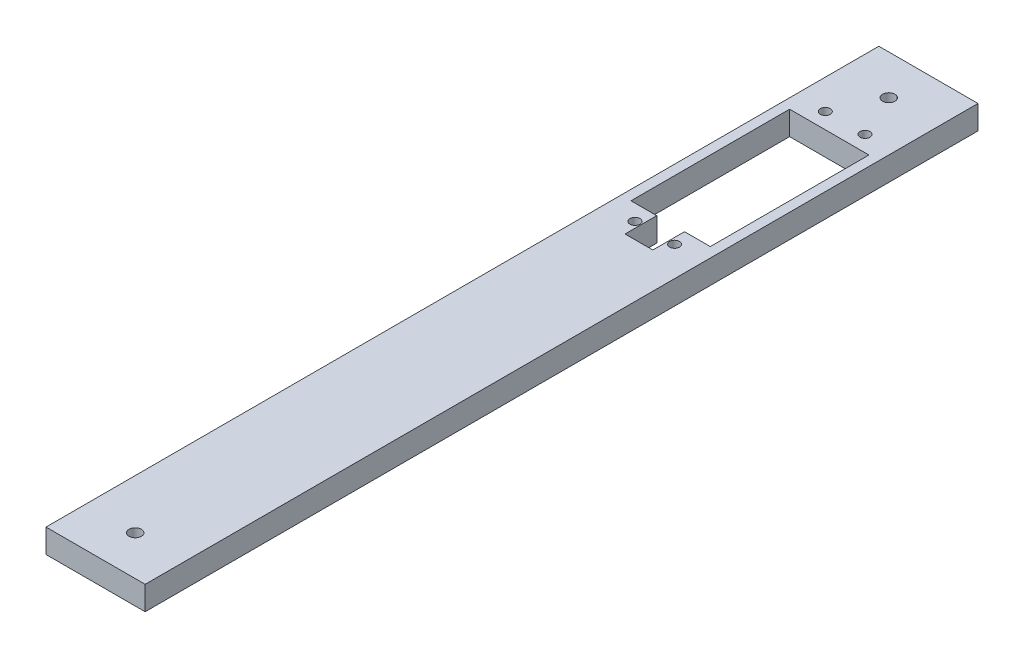
ISO-10303-21;
HEADER;
FILE_DESCRIPTION(('STEP AP214'),'2;1');
FILE_NAME('part.step','',(''),(''),'','','');
FILE_SCHEMA(('AUTOMOTIVE_DESIGN { 1 0 10303 214 1 1 1 1 }'));
ENDSEC;
DATA;
#1=APPLICATION_CONTEXT('core data for automotive mechanical design processes');
#2=APPLICATION_PROTOCOL_DEFINITION('international standard','automotive_design',2000,#1);
#3=PRODUCT_CONTEXT('',#1,'mechanical');
#4=PRODUCT('Part','Part','',(#3));
#5=PRODUCT_RELATED_PRODUCT_CATEGORY('part','',(#4));
#6=PRODUCT_DEFINITION_FORMATION('','',#4);
#7=PRODUCT_DEFINITION_CONTEXT('part definition',#1,'design');
#8=PRODUCT_DEFINITION('design','',#6,#7);
#9=PRODUCT_DEFINITION_SHAPE('','',#8);
#10=(LENGTH_UNIT() NAMED_UNIT(*) SI_UNIT(.MILLI.,.METRE.));
#11=(NAMED_UNIT(*) PLANE_ANGLE_UNIT() SI_UNIT($,.RADIAN.));
#12=(NAMED_UNIT(*) SI_UNIT($,.STERADIAN.) SOLID_ANGLE_UNIT());
#13=UNCERTAINTY_MEASURE_WITH_UNIT(LENGTH_MEASURE(1.E-05),#10,'distance_accuracy_value','');
#14=(GEOMETRIC_REPRESENTATION_CONTEXT(3) GLOBAL_UNCERTAINTY_ASSIGNED_CONTEXT((#13)) GLOBAL_UNIT_ASSIGNED_CONTEXT((#10,
#11,#12)) REPRESENTATION_CONTEXT('',''));
#15=CARTESIAN_POINT('',(0.,0.,0.));
#16=DIRECTION('',(0.,0.,1.));
#17=DIRECTION('',(1.,0.,0.));
#18=AXIS2_PLACEMENT_3D('',#15,#16,#17);
#19=CARTESIAN_POINT('',(-15.6277155080101,6.,-14.6035480061091));
#20=DIRECTION('',(0.,0.,-1.));
#21=DIRECTION('',(-1.,0.,0.));
#22=AXIS2_PLACEMENT_3D('',#19,#20,#21);
#23=PLANE('',#22);
#24=DIRECTION('',(1.,0.,0.));
#25=VECTOR('',#24,1.);
#26=CARTESIAN_POINT('',(-15.6277155080101,0.,-14.6035480061091));
#27=LINE('',#26,#25);
#28=CARTESIAN_POINT('',(-15.6277155080101,0.,-14.6035480061091));
#29=VERTEX_POINT('',#28);
#30=CARTESIAN_POINT('',(9.37228449198993,0.,-14.6035480061091));
#31=VERTEX_POINT('',#30);
#32=EDGE_CURVE('E198',#29,#31,#27,.T.);
#33=ORIENTED_EDGE('',*,*,#32,.F.);
#34=DIRECTION('',(0.,-1.,0.));
#35=VECTOR('',#34,1.);
#36=CARTESIAN_POINT('',(-15.6277155080101,6.,-14.6035480061091));
#37=LINE('',#36,#35);
#38=CARTESIAN_POINT('',(-15.6277155080101,6.,-14.6035480061091));
#39=VERTEX_POINT('',#38);
#40=EDGE_CURVE('E11',#39,#29,#37,.T.);
#41=ORIENTED_EDGE('',*,*,#40,.F.);
#42=DIRECTION('',(1.,0.,0.));
#43=VECTOR('',#42,1.);
#44=CARTESIAN_POINT('',(-15.6277155080101,6.,-14.6035480061091));
#45=LINE('',#44,#43);
#46=CARTESIAN_POINT('',(9.37228449198993,6.,-14.6035480061091));
#47=VERTEX_POINT('',#46);
#48=EDGE_CURVE('E207',#39,#47,#45,.T.);
#49=ORIENTED_EDGE('',*,*,#48,.T.);
#50=DIRECTION('',(0.,-1.,0.));
#51=VECTOR('',#50,1.);
#52=CARTESIAN_POINT('',(9.37228449198993,6.,-14.6035480061091));
#53=LINE('',#52,#51);
#54=EDGE_CURVE('E36',#47,#31,#53,.T.);
#55=ORIENTED_EDGE('',*,*,#54,.T.);
#56=EDGE_LOOP('',(#33,#41,#49,#55));
#57=FACE_BOUND('',#56,.T.);
#58=ADVANCED_FACE('F33',(#57),#23,.T.);
#59=CARTESIAN_POINT('',(-15.6277155080101,6.,-14.6035480061091));
#60=DIRECTION('',(1.,0.,0.));
#61=DIRECTION('',(0.,0.,-1.));
#62=AXIS2_PLACEMENT_3D('',#59,#60,#61);
#63=PLANE('',#62);
#64=DIRECTION('',(0.,0.,1.));
#65=VECTOR('',#64,1.);
#66=CARTESIAN_POINT('',(-15.6277155080101,0.,-14.6035480061091));
#67=LINE('',#66,#65);
#68=CARTESIAN_POINT('',(-15.62771550801,0.,195.396451993891));
#69=VERTEX_POINT('',#68);
#70=EDGE_CURVE('E211',#29,#69,#67,.T.);
#71=ORIENTED_EDGE('',*,*,#70,.T.);
#72=DIRECTION('',(0.,-1.,0.));
#73=VECTOR('',#72,1.);
#74=CARTESIAN_POINT('',(-15.62771550801,6.,195.396451993891));
#75=LINE('',#74,#73);
#76=CARTESIAN_POINT('',(-15.62771550801,6.,195.396451993891));
#77=VERTEX_POINT('',#76);
#78=EDGE_CURVE('E41',#77,#69,#75,.T.);
#79=ORIENTED_EDGE('',*,*,#78,.F.);
#80=DIRECTION('',(0.,0.,1.));
#81=VECTOR('',#80,1.);
#82=CARTESIAN_POINT('',(-15.6277155080101,6.,-14.6035480061091));
#83=LINE('',#82,#81);
#84=EDGE_CURVE('E216',#39,#77,#83,.T.);
#85=ORIENTED_EDGE('',*,*,#84,.F.);
#86=ORIENTED_EDGE('',*,*,#40,.T.);
#87=EDGE_LOOP('',(#71,#79,#85,#86));
#88=FACE_BOUND('',#87,.T.);
#89=ADVANCED_FACE('F242',(#88),#63,.F.);
#90=CARTESIAN_POINT('',(-15.62771550801,6.,195.396451993891));
#91=DIRECTION('',(0.,0.,-1.));
#92=DIRECTION('',(-1.,0.,0.));
#93=AXIS2_PLACEMENT_3D('',#90,#91,#92);
#94=PLANE('',#93);
#95=DIRECTION('',(1.,0.,0.));
#96=VECTOR('',#95,1.);
#97=CARTESIAN_POINT('',(-15.62771550801,0.,195.396451993891));
#98=LINE('',#97,#96);
#99=CARTESIAN_POINT('',(9.37228449198996,0.,195.396451993891));
#100=VERTEX_POINT('',#99);
#101=EDGE_CURVE('E223',#69,#100,#98,.T.);
#102=ORIENTED_EDGE('',*,*,#101,.T.);
#103=DIRECTION('',(0.,-1.,0.));
#104=VECTOR('',#103,1.);
#105=CARTESIAN_POINT('',(9.37228449198996,6.,195.396451993891));
#106=LINE('',#105,#104);
#107=CARTESIAN_POINT('',(9.37228449198996,6.,195.396451993891));
#108=VERTEX_POINT('',#107);
#109=EDGE_CURVE('E228',#108,#100,#106,.T.);
#110=ORIENTED_EDGE('',*,*,#109,.F.);
#111=DIRECTION('',(1.,0.,0.));
#112=VECTOR('',#111,1.);
#113=CARTESIAN_POINT('',(-15.62771550801,6.,195.396451993891));
#114=LINE('',#113,#112);
#115=EDGE_CURVE('E214',#77,#108,#114,.T.);
#116=ORIENTED_EDGE('',*,*,#115,.F.);
#117=ORIENTED_EDGE('',*,*,#78,.T.);
#118=EDGE_LOOP('',(#102,#110,#116,#117));
#119=FACE_BOUND('',#118,.T.);
#120=ADVANCED_FACE('F246',(#119),#94,.F.);
#121=CARTESIAN_POINT('',(9.37228449198993,6.,-14.6035480061091));
#122=DIRECTION('',(1.,0.,0.));
#123=DIRECTION('',(0.,0.,-1.));
#124=AXIS2_PLACEMENT_3D('',#121,#122,#123);
#125=PLANE('',#124);
#126=DIRECTION('',(0.,0.,1.));
#127=VECTOR('',#126,1.);
#128=CARTESIAN_POINT('',(9.37228449198993,0.,-14.6035480061091));
#129=LINE('',#128,#127);
#130=EDGE_CURVE('E220',#31,#100,#129,.T.);
#131=ORIENTED_EDGE('',*,*,#130,.F.);
#132=ORIENTED_EDGE('',*,*,#54,.F.);
#133=DIRECTION('',(0.,0.,1.));
#134=VECTOR('',#133,1.);
#135=CARTESIAN_POINT('',(9.37228449198993,6.,-14.6035480061091));
#136=LINE('',#135,#134);
#137=EDGE_CURVE('E210',#47,#108,#136,.T.);
#138=ORIENTED_EDGE('',*,*,#137,.T.);
#139=ORIENTED_EDGE('',*,*,#109,.T.);
#140=EDGE_LOOP('',(#131,#132,#138,#139));
#141=FACE_BOUND('',#140,.T.);
#142=ADVANCED_FACE('F236',(#141),#125,.T.);
#143=CARTESIAN_POINT('',(0.,6.,0.));
#144=DIRECTION('',(0.,-1.,0.));
#145=DIRECTION('',(0.,0.,-1.));
#146=AXIS2_PLACEMENT_3D('',#143,#144,#145);
#147=PLANE('',#146);
#148=CARTESIAN_POINT('',(-8.12771550801006,6.,6.39645199389089));
#149=DIRECTION('',(0.,1.,0.));
#150=DIRECTION('',(0.,0.,-1.));
#151=AXIS2_PLACEMENT_3D('',#148,#149,#150);
#152=CIRCLE('',#151,1.25);
#153=CARTESIAN_POINT('',(-8.12771550801006,6.,5.14645199389089));
#154=VERTEX_POINT('',#153);
#155=EDGE_CURVE('E147',#154,#154,#152,.T.);
#156=ORIENTED_EDGE('',*,*,#155,.F.);
#157=EDGE_LOOP('',(#156));
#158=FACE_BOUND('',#157,.T.);
#159=CARTESIAN_POINT('',(1.87228449198994,6.,6.39645199389089));
#160=DIRECTION('',(0.,1.,0.));
#161=DIRECTION('',(0.,0.,1.));
#162=AXIS2_PLACEMENT_3D('',#159,#160,#161);
#163=CIRCLE('',#162,1.25);
#164=CARTESIAN_POINT('',(1.87228449198994,6.,7.64645199389089));
#165=VERTEX_POINT('',#164);
#166=EDGE_CURVE('E429',#165,#165,#163,.T.);
#167=ORIENTED_EDGE('',*,*,#166,.F.);
#168=EDGE_LOOP('',(#167));
#169=FACE_BOUND('',#168,.T.);
#170=CARTESIAN_POINT('',(1.87228449198994,6.,54.3964519938909));
#171=DIRECTION('',(0.,1.,0.));
#172=DIRECTION('',(0.,0.,-1.));
#173=AXIS2_PLACEMENT_3D('',#170,#171,#172);
#174=CIRCLE('',#173,1.25);
#175=CARTESIAN_POINT('',(1.87228449198994,6.,53.1464519938909));
#176=VERTEX_POINT('',#175);
#177=EDGE_CURVE('E436',#176,#176,#174,.T.);
#178=ORIENTED_EDGE('',*,*,#177,.F.);
#179=EDGE_LOOP('',(#178));
#180=FACE_BOUND('',#179,.T.);
#181=CARTESIAN_POINT('',(-8.12771550801006,6.,54.3964519938909));
#182=DIRECTION('',(0.,1.,0.));
#183=DIRECTION('',(0.,0.,1.));
#184=AXIS2_PLACEMENT_3D('',#181,#182,#183);
#185=CIRCLE('',#184,1.25);
#186=CARTESIAN_POINT('',(-8.12771550801006,6.,55.6464519938909));
#187=VERTEX_POINT('',#186);
#188=EDGE_CURVE('E442',#187,#187,#185,.T.);
#189=ORIENTED_EDGE('',*,*,#188,.F.);
#190=EDGE_LOOP('',(#189));
#191=FACE_BOUND('',#190,.T.);
#192=DIRECTION('',(1.,0.,0.));
#193=VECTOR('',#192,1.);
#194=CARTESIAN_POINT('',(-13.1277155080101,6.,50.3964519938909));
#195=LINE('',#194,#193);
#196=CARTESIAN_POINT('',(-13.1277155080101,6.,50.3964519938909));
#197=VERTEX_POINT('',#196);
#198=CARTESIAN_POINT('',(-6.62771550801007,6.,50.3964519938909));
#199=VERTEX_POINT('',#198);
#200=EDGE_CURVE('E164',#197,#199,#195,.T.);
#201=ORIENTED_EDGE('',*,*,#200,.F.);
#202=DIRECTION('',(0.,0.,1.));
#203=VECTOR('',#202,1.);
#204=CARTESIAN_POINT('',(-13.1277155080101,6.,10.3964519938909));
#205=LINE('',#204,#203);
#206=CARTESIAN_POINT('',(-13.1277155080101,6.,10.3964519938909));
#207=VERTEX_POINT('',#206);
#208=EDGE_CURVE('E49',#207,#197,#205,.T.);
#209=ORIENTED_EDGE('',*,*,#208,.F.);
#210=DIRECTION('',(-1.,0.,0.));
#211=VECTOR('',#210,1.);
#212=CARTESIAN_POINT('',(-13.1277155080101,6.,10.3964519938909));
#213=LINE('',#212,#211);
#214=CARTESIAN_POINT('',(6.87228449198993,6.,10.3964519938909));
#215=VERTEX_POINT('',#214);
#216=EDGE_CURVE('E141',#215,#207,#213,.T.);
#217=ORIENTED_EDGE('',*,*,#216,.F.);
#218=DIRECTION('',(0.,0.,-1.));
#219=VECTOR('',#218,1.);
#220=CARTESIAN_POINT('',(6.87228449198993,6.,10.3964519938909));
#221=LINE('',#220,#219);
#222=CARTESIAN_POINT('',(6.87228449198994,6.,50.3964519938909));
#223=VERTEX_POINT('',#222);
#224=EDGE_CURVE('E144',#223,#215,#221,.T.);
#225=ORIENTED_EDGE('',*,*,#224,.F.);
#226=DIRECTION('',(1.,0.,0.));
#227=VECTOR('',#226,1.);
#228=CARTESIAN_POINT('',(0.372284491989933,6.,50.3964519938909));
#229=LINE('',#228,#227);
#230=CARTESIAN_POINT('',(0.372284491989933,6.,50.3964519938909));
#231=VERTEX_POINT('',#230);
#232=EDGE_CURVE('E176',#231,#223,#229,.T.);
#233=ORIENTED_EDGE('',*,*,#232,.F.);
#234=DIRECTION('',(0.,0.,-1.));
#235=VECTOR('',#234,1.);
#236=CARTESIAN_POINT('',(0.372284491989933,6.,58.3964519938909));
#237=LINE('',#236,#235);
#238=CARTESIAN_POINT('',(0.372284491989933,6.,58.3964519938909));
#239=VERTEX_POINT('',#238);
#240=EDGE_CURVE('E173',#239,#231,#237,.T.);
#241=ORIENTED_EDGE('',*,*,#240,.F.);
#242=DIRECTION('',(1.,0.,0.));
#243=VECTOR('',#242,1.);
#244=CARTESIAN_POINT('',(-6.62771550801007,6.,58.3964519938909));
#245=LINE('',#244,#243);
#246=CARTESIAN_POINT('',(-6.62771550801007,6.,58.3964519938909));
#247=VERTEX_POINT('',#246);
#248=EDGE_CURVE('E170',#247,#239,#245,.T.);
#249=ORIENTED_EDGE('',*,*,#248,.F.);
#250=DIRECTION('',(0.,0.,1.));
#251=VECTOR('',#250,1.);
#252=CARTESIAN_POINT('',(-6.62771550801007,6.,58.3964519938909));
#253=LINE('',#252,#251);
#254=EDGE_CURVE('E167',#199,#247,#253,.T.);
#255=ORIENTED_EDGE('',*,*,#254,.F.);
#256=EDGE_LOOP('',(#201,#209,#217,#225,#233,#241,#249,#255));
#257=FACE_BOUND('',#256,.T.);
#258=CARTESIAN_POINT('',(-3.12771550801007,6.,-4.60354800610911));
#259=DIRECTION('',(0.,1.,0.));
#260=DIRECTION('',(0.,0.,1.));
#261=AXIS2_PLACEMENT_3D('',#258,#259,#260);
#262=CIRCLE('',#261,1.55);
#263=CARTESIAN_POINT('',(-3.12771550801007,6.,-3.05354800610911));
#264=VERTEX_POINT('',#263);
#265=EDGE_CURVE('E199',#264,#264,#262,.T.);
#266=ORIENTED_EDGE('',*,*,#265,.F.);
#267=EDGE_LOOP('',(#266));
#268=FACE_BOUND('',#267,.T.);
#269=CARTESIAN_POINT('',(-3.12771550801007,6.,185.396451993891));
#270=DIRECTION('',(0.,1.,0.));
#271=DIRECTION('',(0.,0.,-1.));
#272=AXIS2_PLACEMENT_3D('',#269,#270,#271);
#273=CIRCLE('',#272,1.55);
#274=CARTESIAN_POINT('',(-3.12771550801007,6.,183.846451993891));
#275=VERTEX_POINT('',#274);
#276=EDGE_CURVE('E183',#275,#275,#273,.T.);
#277=ORIENTED_EDGE('',*,*,#276,.F.);
#278=EDGE_LOOP('',(#277));
#279=FACE_BOUND('',#278,.T.);
#280=ORIENTED_EDGE('',*,*,#48,.F.);
#281=ORIENTED_EDGE('',*,*,#84,.T.);
#282=ORIENTED_EDGE('',*,*,#115,.T.);
#283=ORIENTED_EDGE('',*,*,#137,.F.);
#284=EDGE_LOOP('',(#280,#281,#282,#283));
#285=FACE_BOUND('',#284,.T.);
#286=ADVANCED_FACE('F248',(#158,#169,#180,#191,#257,#268,#279,#285),#147,.F.);
#287=CARTESIAN_POINT('',(0.,0.,0.));
#288=DIRECTION('',(0.,-1.,0.));
#289=DIRECTION('',(0.,0.,-1.));
#290=AXIS2_PLACEMENT_3D('',#287,#288,#289);
#291=PLANE('',#290);
#292=CARTESIAN_POINT('',(-8.12771550801006,0.,6.39645199389089));
#293=DIRECTION('',(0.,1.,0.));
#294=DIRECTION('',(0.,0.,-1.));
#295=AXIS2_PLACEMENT_3D('',#292,#293,#294);
#296=CIRCLE('',#295,1.25);
#297=CARTESIAN_POINT('',(-8.12771550801006,0.,5.14645199389089));
#298=VERTEX_POINT('',#297);
#299=EDGE_CURVE('E427',#298,#298,#296,.T.);
#300=ORIENTED_EDGE('',*,*,#299,.T.);
#301=EDGE_LOOP('',(#300));
#302=FACE_BOUND('',#301,.T.);
#303=CARTESIAN_POINT('',(1.87228449198994,0.,6.39645199389089));
#304=DIRECTION('',(0.,1.,0.));
#305=DIRECTION('',(0.,0.,1.));
#306=AXIS2_PLACEMENT_3D('',#303,#304,#305);
#307=CIRCLE('',#306,1.25);
#308=CARTESIAN_POINT('',(1.87228449198994,0.,7.64645199389089));
#309=VERTEX_POINT('',#308);
#310=EDGE_CURVE('E431',#309,#309,#307,.T.);
#311=ORIENTED_EDGE('',*,*,#310,.T.);
#312=EDGE_LOOP('',(#311));
#313=FACE_BOUND('',#312,.T.);
#314=CARTESIAN_POINT('',(1.87228449198994,0.,54.3964519938909));
#315=DIRECTION('',(0.,1.,0.));
#316=DIRECTION('',(0.,0.,-1.));
#317=AXIS2_PLACEMENT_3D('',#314,#315,#316);
#318=CIRCLE('',#317,1.25);
#319=CARTESIAN_POINT('',(1.87228449198994,0.,53.1464519938909));
#320=VERTEX_POINT('',#319);
#321=EDGE_CURVE('E439',#320,#320,#318,.T.);
#322=ORIENTED_EDGE('',*,*,#321,.T.);
#323=EDGE_LOOP('',(#322));
#324=FACE_BOUND('',#323,.T.);
#325=CARTESIAN_POINT('',(-8.12771550801006,0.,54.3964519938909));
#326=DIRECTION('',(0.,1.,0.));
#327=DIRECTION('',(0.,0.,1.));
#328=AXIS2_PLACEMENT_3D('',#325,#326,#327);
#329=CIRCLE('',#328,1.25);
#330=CARTESIAN_POINT('',(-8.12771550801006,0.,55.6464519938909));
#331=VERTEX_POINT('',#330);
#332=EDGE_CURVE('E165',#331,#331,#329,.T.);
#333=ORIENTED_EDGE('',*,*,#332,.T.);
#334=EDGE_LOOP('',(#333));
#335=FACE_BOUND('',#334,.T.);
#336=DIRECTION('',(0.,0.,1.));
#337=VECTOR('',#336,1.);
#338=CARTESIAN_POINT('',(-13.1277155080101,0.,10.3964519938909));
#339=LINE('',#338,#337);
#340=CARTESIAN_POINT('',(-13.1277155080101,0.,10.3964519938909));
#341=VERTEX_POINT('',#340);
#342=CARTESIAN_POINT('',(-13.1277155080101,0.,50.3964519938909));
#343=VERTEX_POINT('',#342);
#344=EDGE_CURVE('E124',#341,#343,#339,.T.);
#345=ORIENTED_EDGE('',*,*,#344,.T.);
#346=DIRECTION('',(1.,0.,0.));
#347=VECTOR('',#346,1.);
#348=CARTESIAN_POINT('',(-13.1277155080101,0.,50.3964519938909));
#349=LINE('',#348,#347);
#350=CARTESIAN_POINT('',(-6.62771550801007,0.,50.3964519938909));
#351=VERTEX_POINT('',#350);
#352=EDGE_CURVE('E133',#343,#351,#349,.T.);
#353=ORIENTED_EDGE('',*,*,#352,.T.);
#354=DIRECTION('',(0.,0.,1.));
#355=VECTOR('',#354,1.);
#356=CARTESIAN_POINT('',(-6.62771550801007,0.,58.3964519938909));
#357=LINE('',#356,#355);
#358=CARTESIAN_POINT('',(-6.62771550801007,0.,58.3964519938909));
#359=VERTEX_POINT('',#358);
#360=EDGE_CURVE('E57',#351,#359,#357,.T.);
#361=ORIENTED_EDGE('',*,*,#360,.T.);
#362=DIRECTION('',(1.,0.,0.));
#363=VECTOR('',#362,1.);
#364=CARTESIAN_POINT('',(-6.62771550801007,0.,58.3964519938909));
#365=LINE('',#364,#363);
#366=CARTESIAN_POINT('',(0.372284491989933,0.,58.3964519938909));
#367=VERTEX_POINT('',#366);
#368=EDGE_CURVE('E151',#359,#367,#365,.T.);
#369=ORIENTED_EDGE('',*,*,#368,.T.);
#370=DIRECTION('',(0.,0.,-1.));
#371=VECTOR('',#370,1.);
#372=CARTESIAN_POINT('',(0.372284491989933,0.,58.3964519938909));
#373=LINE('',#372,#371);
#374=CARTESIAN_POINT('',(0.372284491989933,0.,50.3964519938909));
#375=VERTEX_POINT('',#374);
#376=EDGE_CURVE('E154',#367,#375,#373,.T.);
#377=ORIENTED_EDGE('',*,*,#376,.T.);
#378=DIRECTION('',(1.,0.,0.));
#379=VECTOR('',#378,1.);
#380=CARTESIAN_POINT('',(0.372284491989933,0.,50.3964519938909));
#381=LINE('',#380,#379);
#382=CARTESIAN_POINT('',(6.87228449198994,0.,50.3964519938909));
#383=VERTEX_POINT('',#382);
#384=EDGE_CURVE('E157',#375,#383,#381,.T.);
#385=ORIENTED_EDGE('',*,*,#384,.T.);
#386=DIRECTION('',(0.,0.,-1.));
#387=VECTOR('',#386,1.);
#388=CARTESIAN_POINT('',(6.87228449198993,0.,10.3964519938909));
#389=LINE('',#388,#387);
#390=CARTESIAN_POINT('',(6.87228449198993,0.,10.3964519938909));
#391=VERTEX_POINT('',#390);
#392=EDGE_CURVE('E160',#383,#391,#389,.T.);
#393=ORIENTED_EDGE('',*,*,#392,.T.);
#394=DIRECTION('',(-1.,0.,0.));
#395=VECTOR('',#394,1.);
#396=CARTESIAN_POINT('',(-13.1277155080101,0.,10.3964519938909));
#397=LINE('',#396,#395);
#398=EDGE_CURVE('E130',#391,#341,#397,.T.);
#399=ORIENTED_EDGE('',*,*,#398,.T.);
#400=EDGE_LOOP('',(#345,#353,#361,#369,#377,#385,#393,#399));
#401=FACE_BOUND('',#400,.T.);
#402=CARTESIAN_POINT('',(-3.12771550801007,0.,-4.60354800610911));
#403=DIRECTION('',(0.,1.,0.));
#404=DIRECTION('',(0.,0.,1.));
#405=AXIS2_PLACEMENT_3D('',#402,#403,#404);
#406=CIRCLE('',#405,1.55);
#407=CARTESIAN_POINT('',(-3.12771550801007,0.,-3.05354800610911));
#408=VERTEX_POINT('',#407);
#409=EDGE_CURVE('E195',#408,#408,#406,.T.);
#410=ORIENTED_EDGE('',*,*,#409,.T.);
#411=EDGE_LOOP('',(#410));
#412=FACE_BOUND('',#411,.T.);
#413=CARTESIAN_POINT('',(-3.12771550801007,0.,185.396451993891));
#414=DIRECTION('',(0.,1.,0.));
#415=DIRECTION('',(0.,0.,-1.));
#416=AXIS2_PLACEMENT_3D('',#413,#414,#415);
#417=CIRCLE('',#416,1.55);
#418=CARTESIAN_POINT('',(-3.12771550801007,0.,183.846451993891));
#419=VERTEX_POINT('',#418);
#420=EDGE_CURVE('E202',#419,#419,#417,.T.);
#421=ORIENTED_EDGE('',*,*,#420,.T.);
#422=EDGE_LOOP('',(#421));
#423=FACE_BOUND('',#422,.T.);
#424=ORIENTED_EDGE('',*,*,#32,.T.);
#425=ORIENTED_EDGE('',*,*,#130,.T.);
#426=ORIENTED_EDGE('',*,*,#101,.F.);
#427=ORIENTED_EDGE('',*,*,#70,.F.);
#428=EDGE_LOOP('',(#424,#425,#426,#427));
#429=FACE_BOUND('',#428,.T.);
#430=ADVANCED_FACE('F137',(#302,#313,#324,#335,#401,#412,#423,#429),#291,.T.);
#431=CARTESIAN_POINT('',(-3.12771550801007,0.,185.396451993891));
#432=DIRECTION('',(0.,1.,0.));
#433=DIRECTION('',(0.,0.,1.));
#434=AXIS2_PLACEMENT_3D('',#431,#432,#433);
#435=CYLINDRICAL_SURFACE('',#434,1.55);
#436=ORIENTED_EDGE('',*,*,#420,.F.);
#437=EDGE_LOOP('',(#436));
#438=FACE_BOUND('',#437,.T.);
#439=ORIENTED_EDGE('',*,*,#276,.T.);
#440=EDGE_LOOP('',(#439));
#441=FACE_BOUND('',#440,.T.);
#442=ADVANCED_FACE('F256',(#438,#441),#435,.F.);
#443=CARTESIAN_POINT('',(-3.12771550801007,0.,-4.60354800610911));
#444=DIRECTION('',(0.,1.,0.));
#445=DIRECTION('',(0.,0.,1.));
#446=AXIS2_PLACEMENT_3D('',#443,#444,#445);
#447=CYLINDRICAL_SURFACE('',#446,1.55);
#448=ORIENTED_EDGE('',*,*,#409,.F.);
#449=EDGE_LOOP('',(#448));
#450=FACE_BOUND('',#449,.T.);
#451=ORIENTED_EDGE('',*,*,#265,.T.);
#452=EDGE_LOOP('',(#451));
#453=FACE_BOUND('',#452,.T.);
#454=ADVANCED_FACE('F287',(#450,#453),#447,.F.);
#455=CARTESIAN_POINT('',(-13.1277155080101,0.,10.3964519938909));
#456=DIRECTION('',(-1.,0.,0.));
#457=DIRECTION('',(0.,0.,1.));
#458=AXIS2_PLACEMENT_3D('',#455,#456,#457);
#459=PLANE('',#458);
#460=ORIENTED_EDGE('',*,*,#208,.T.);
#461=DIRECTION('',(0.,1.,0.));
#462=VECTOR('',#461,1.);
#463=CARTESIAN_POINT('',(-13.1277155080101,0.,50.3964519938909));
#464=LINE('',#463,#462);
#465=EDGE_CURVE('E120',#343,#197,#464,.T.);
#466=ORIENTED_EDGE('',*,*,#465,.F.);
#467=ORIENTED_EDGE('',*,*,#344,.F.);
#468=DIRECTION('',(0.,1.,0.));
#469=VECTOR('',#468,1.);
#470=CARTESIAN_POINT('',(-13.1277155080101,0.,10.3964519938909));
#471=LINE('',#470,#469);
#472=EDGE_CURVE('E181',#341,#207,#471,.T.);
#473=ORIENTED_EDGE('',*,*,#472,.T.);
#474=EDGE_LOOP('',(#460,#466,#467,#473));
#475=FACE_BOUND('',#474,.T.);
#476=ADVANCED_FACE('F122',(#475),#459,.F.);
#477=CARTESIAN_POINT('',(-13.1277155080101,0.,10.3964519938909));
#478=DIRECTION('',(0.,0.,-1.));
#479=DIRECTION('',(-1.,0.,0.));
#480=AXIS2_PLACEMENT_3D('',#477,#478,#479);
#481=PLANE('',#480);
#482=ORIENTED_EDGE('',*,*,#216,.T.);
#483=ORIENTED_EDGE('',*,*,#472,.F.);
#484=ORIENTED_EDGE('',*,*,#398,.F.);
#485=DIRECTION('',(0.,1.,0.));
#486=VECTOR('',#485,1.);
#487=CARTESIAN_POINT('',(6.87228449198993,0.,10.3964519938909));
#488=LINE('',#487,#486);
#489=EDGE_CURVE('E184',#391,#215,#488,.T.);
#490=ORIENTED_EDGE('',*,*,#489,.T.);
#491=EDGE_LOOP('',(#482,#483,#484,#490));
#492=FACE_BOUND('',#491,.T.);
#493=ADVANCED_FACE('F314',(#492),#481,.F.);
#494=CARTESIAN_POINT('',(6.87228449198993,0.,10.3964519938909));
#495=DIRECTION('',(1.,0.,0.));
#496=DIRECTION('',(0.,0.,-1.));
#497=AXIS2_PLACEMENT_3D('',#494,#495,#496);
#498=PLANE('',#497);
#499=ORIENTED_EDGE('',*,*,#224,.T.);
#500=ORIENTED_EDGE('',*,*,#489,.F.);
#501=ORIENTED_EDGE('',*,*,#392,.F.);
#502=DIRECTION('',(0.,1.,0.));
#503=VECTOR('',#502,1.);
#504=CARTESIAN_POINT('',(6.87228449198994,0.,50.3964519938909));
#505=LINE('',#504,#503);
#506=EDGE_CURVE('E186',#383,#223,#505,.T.);
#507=ORIENTED_EDGE('',*,*,#506,.T.);
#508=EDGE_LOOP('',(#499,#500,#501,#507));
#509=FACE_BOUND('',#508,.T.);
#510=ADVANCED_FACE('F323',(#509),#498,.F.);
#511=CARTESIAN_POINT('',(0.372284491989933,0.,50.3964519938909));
#512=DIRECTION('',(0.,0.,1.));
#513=DIRECTION('',(1.,0.,0.));
#514=AXIS2_PLACEMENT_3D('',#511,#512,#513);
#515=PLANE('',#514);
#516=ORIENTED_EDGE('',*,*,#232,.T.);
#517=ORIENTED_EDGE('',*,*,#506,.F.);
#518=ORIENTED_EDGE('',*,*,#384,.F.);
#519=DIRECTION('',(0.,1.,0.));
#520=VECTOR('',#519,1.);
#521=CARTESIAN_POINT('',(0.372284491989933,0.,50.3964519938909));
#522=LINE('',#521,#520);
#523=EDGE_CURVE('E188',#375,#231,#522,.T.);
#524=ORIENTED_EDGE('',*,*,#523,.T.);
#525=EDGE_LOOP('',(#516,#517,#518,#524));
#526=FACE_BOUND('',#525,.T.);
#527=ADVANCED_FACE('F333',(#526),#515,.F.);
#528=CARTESIAN_POINT('',(0.372284491989933,0.,58.3964519938909));
#529=DIRECTION('',(1.,0.,0.));
#530=DIRECTION('',(0.,0.,-1.));
#531=AXIS2_PLACEMENT_3D('',#528,#529,#530);
#532=PLANE('',#531);
#533=ORIENTED_EDGE('',*,*,#240,.T.);
#534=ORIENTED_EDGE('',*,*,#523,.F.);
#535=ORIENTED_EDGE('',*,*,#376,.F.);
#536=DIRECTION('',(0.,1.,0.));
#537=VECTOR('',#536,1.);
#538=CARTESIAN_POINT('',(0.372284491989933,0.,58.3964519938909));
#539=LINE('',#538,#537);
#540=EDGE_CURVE('E190',#367,#239,#539,.T.);
#541=ORIENTED_EDGE('',*,*,#540,.T.);
#542=EDGE_LOOP('',(#533,#534,#535,#541));
#543=FACE_BOUND('',#542,.T.);
#544=ADVANCED_FACE('F343',(#543),#532,.F.);
#545=CARTESIAN_POINT('',(-6.62771550801007,0.,58.3964519938909));
#546=DIRECTION('',(0.,0.,1.));
#547=DIRECTION('',(1.,0.,0.));
#548=AXIS2_PLACEMENT_3D('',#545,#546,#547);
#549=PLANE('',#548);
#550=ORIENTED_EDGE('',*,*,#248,.T.);
#551=ORIENTED_EDGE('',*,*,#540,.F.);
#552=ORIENTED_EDGE('',*,*,#368,.F.);
#553=DIRECTION('',(0.,1.,0.));
#554=VECTOR('',#553,1.);
#555=CARTESIAN_POINT('',(-6.62771550801007,0.,58.3964519938909));
#556=LINE('',#555,#554);
#557=EDGE_CURVE('E192',#359,#247,#556,.T.);
#558=ORIENTED_EDGE('',*,*,#557,.T.);
#559=EDGE_LOOP('',(#550,#551,#552,#558));
#560=FACE_BOUND('',#559,.T.);
#561=ADVANCED_FACE('F353',(#560),#549,.F.);
#562=CARTESIAN_POINT('',(-6.62771550801007,0.,58.3964519938909));
#563=DIRECTION('',(-1.,0.,0.));
#564=DIRECTION('',(0.,0.,1.));
#565=AXIS2_PLACEMENT_3D('',#562,#563,#564);
#566=PLANE('',#565);
#567=ORIENTED_EDGE('',*,*,#254,.T.);
#568=ORIENTED_EDGE('',*,*,#557,.F.);
#569=ORIENTED_EDGE('',*,*,#360,.F.);
#570=DIRECTION('',(0.,1.,0.));
#571=VECTOR('',#570,1.);
#572=CARTESIAN_POINT('',(-6.62771550801007,0.,50.3964519938909));
#573=LINE('',#572,#571);
#574=EDGE_CURVE('E129',#351,#199,#573,.T.);
#575=ORIENTED_EDGE('',*,*,#574,.T.);
#576=EDGE_LOOP('',(#567,#568,#569,#575));
#577=FACE_BOUND('',#576,.T.);
#578=ADVANCED_FACE('F363',(#577),#566,.F.);
#579=CARTESIAN_POINT('',(-13.1277155080101,0.,50.3964519938909));
#580=DIRECTION('',(0.,0.,1.));
#581=DIRECTION('',(1.,0.,0.));
#582=AXIS2_PLACEMENT_3D('',#579,#580,#581);
#583=PLANE('',#582);
#584=ORIENTED_EDGE('',*,*,#200,.T.);
#585=ORIENTED_EDGE('',*,*,#574,.F.);
#586=ORIENTED_EDGE('',*,*,#352,.F.);
#587=ORIENTED_EDGE('',*,*,#465,.T.);
#588=EDGE_LOOP('',(#584,#585,#586,#587));
#589=FACE_BOUND('',#588,.T.);
#590=ADVANCED_FACE('F134',(#589),#583,.F.);
#591=CARTESIAN_POINT('',(-8.12771550801006,0.,54.3964519938909));
#592=DIRECTION('',(0.,1.,0.));
#593=DIRECTION('',(0.,0.,1.));
#594=AXIS2_PLACEMENT_3D('',#591,#592,#593);
#595=CYLINDRICAL_SURFACE('',#594,1.25);
#596=ORIENTED_EDGE('',*,*,#332,.F.);
#597=EDGE_LOOP('',(#596));
#598=FACE_BOUND('',#597,.T.);
#599=ORIENTED_EDGE('',*,*,#188,.T.);
#600=EDGE_LOOP('',(#599));
#601=FACE_BOUND('',#600,.T.);
#602=ADVANCED_FACE('F381',(#598,#601),#595,.F.);
#603=CARTESIAN_POINT('',(1.87228449198994,0.,54.3964519938909));
#604=DIRECTION('',(0.,1.,0.));
#605=DIRECTION('',(0.,0.,1.));
#606=AXIS2_PLACEMENT_3D('',#603,#604,#605);
#607=CYLINDRICAL_SURFACE('',#606,1.25);
#608=ORIENTED_EDGE('',*,*,#321,.F.);
#609=EDGE_LOOP('',(#608));
#610=FACE_BOUND('',#609,.T.);
#611=ORIENTED_EDGE('',*,*,#177,.T.);
#612=EDGE_LOOP('',(#611));
#613=FACE_BOUND('',#612,.T.);
#614=ADVANCED_FACE('F390',(#610,#613),#607,.F.);
#615=CARTESIAN_POINT('',(1.87228449198994,0.,6.39645199389089));
#616=DIRECTION('',(0.,1.,0.));
#617=DIRECTION('',(0.,0.,1.));
#618=AXIS2_PLACEMENT_3D('',#615,#616,#617);
#619=CYLINDRICAL_SURFACE('',#618,1.25);
#620=ORIENTED_EDGE('',*,*,#310,.F.);
#621=EDGE_LOOP('',(#620));
#622=FACE_BOUND('',#621,.T.);
#623=ORIENTED_EDGE('',*,*,#166,.T.);
#624=EDGE_LOOP('',(#623));
#625=FACE_BOUND('',#624,.T.);
#626=ADVANCED_FACE('F400',(#622,#625),#619,.F.);
#627=CARTESIAN_POINT('',(-8.12771550801006,0.,6.39645199389089));
#628=DIRECTION('',(0.,1.,0.));
#629=DIRECTION('',(0.,0.,1.));
#630=AXIS2_PLACEMENT_3D('',#627,#628,#629);
#631=CYLINDRICAL_SURFACE('',#630,1.25);
#632=ORIENTED_EDGE('',*,*,#299,.F.);
#633=EDGE_LOOP('',(#632));
#634=FACE_BOUND('',#633,.T.);
#635=ORIENTED_EDGE('',*,*,#155,.T.);
#636=EDGE_LOOP('',(#635));
#637=FACE_BOUND('',#636,.T.);
#638=ADVANCED_FACE('F410',(#634,#637),#631,.F.);
#639=CLOSED_SHELL('',(#58,#89,#120,#142,#286,#430,#442,#454,#476,#493,#510,#527,#544,#561,#578,
#590,#602,#614,#626,#638));
#640=MANIFOLD_SOLID_BREP('B2',#639);
#641=ADVANCED_BREP_SHAPE_REPRESENTATION('',(#18,#640),#14);
#642=SHAPE_DEFINITION_REPRESENTATION(#9,#641);
ENDSEC;
END-ISO-10303-21;
